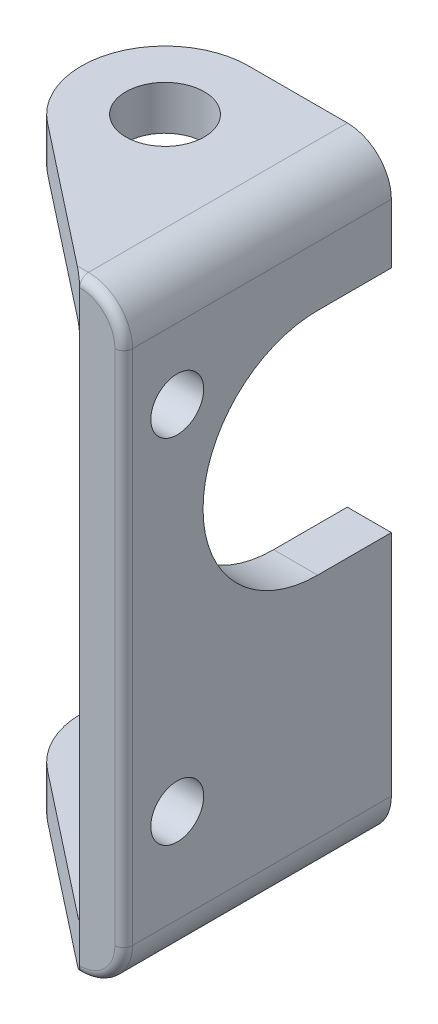
ISO-10303-21;
HEADER;
FILE_DESCRIPTION(('STEP AP214'),'2;1');
FILE_NAME('part.step','',(''),(''),'','','');
FILE_SCHEMA(('AUTOMOTIVE_DESIGN { 1 0 10303 214 1 1 1 1 }'));
ENDSEC;
DATA;
#1=APPLICATION_CONTEXT('core data for automotive mechanical design processes');
#2=APPLICATION_PROTOCOL_DEFINITION('international standard','automotive_design',2000,#1);
#3=PRODUCT_CONTEXT('',#1,'mechanical');
#4=PRODUCT('Part','Part','',(#3));
#5=PRODUCT_RELATED_PRODUCT_CATEGORY('part','',(#4));
#6=PRODUCT_DEFINITION_FORMATION('','',#4);
#7=PRODUCT_DEFINITION_CONTEXT('part definition',#1,'design');
#8=PRODUCT_DEFINITION('design','',#6,#7);
#9=PRODUCT_DEFINITION_SHAPE('','',#8);
#10=(LENGTH_UNIT() NAMED_UNIT(*) SI_UNIT(.MILLI.,.METRE.));
#11=(NAMED_UNIT(*) PLANE_ANGLE_UNIT() SI_UNIT($,.RADIAN.));
#12=(NAMED_UNIT(*) SI_UNIT($,.STERADIAN.) SOLID_ANGLE_UNIT());
#13=UNCERTAINTY_MEASURE_WITH_UNIT(LENGTH_MEASURE(1.E-05),#10,'distance_accuracy_value','');
#14=(GEOMETRIC_REPRESENTATION_CONTEXT(3) GLOBAL_UNCERTAINTY_ASSIGNED_CONTEXT((#13)) GLOBAL_UNIT_ASSIGNED_CONTEXT((#10,
#11,#12)) REPRESENTATION_CONTEXT('',''));
#15=CARTESIAN_POINT('',(0.,0.,0.));
#16=DIRECTION('',(0.,0.,1.));
#17=DIRECTION('',(1.,0.,0.));
#18=AXIS2_PLACEMENT_3D('',#15,#16,#17);
#19=CARTESIAN_POINT('',(-5.86914092412424,-34.32,7.46916448885226));
#20=DIRECTION('',(0.617854856392093,0.,-0.786292169891514));
#21=DIRECTION('',(-0.786292169891514,0.,-0.617854856392093));
#22=AXIS2_PLACEMENT_3D('',#19,#20,#21);
#23=PLANE('',#22);
#24=DIRECTION('',(-0.786292169891514,0.,-0.617854856392093));
#25=VECTOR('',#24,1.);
#26=CARTESIAN_POINT('',(-5.86914092412424,-34.32,7.46916448885226));
#27=LINE('',#26,#25);
#28=CARTESIAN_POINT('',(9.90738368606019,-34.32,19.8660860412273));
#29=VERTEX_POINT('',#28);
#30=CARTESIAN_POINT('',(-5.86914092412424,-34.32,7.46916448885226));
#31=VERTEX_POINT('',#30);
#32=EDGE_CURVE('E336',#29,#31,#27,.T.);
#33=ORIENTED_EDGE('',*,*,#32,.F.);
#34=CARTESIAN_POINT('',(9.90738368606019,-33.32,19.8660860412273));
#35=DIRECTION('',(0.617854856392093,0.,-0.786292169891514));
#36=DIRECTION('',(0.786292169891514,0.,0.617854856392093));
#37=AXIS2_PLACEMENT_3D('',#34,#35,#36);
#38=ELLIPSE('',#37,1.61850309931916,1.);
#39=CARTESIAN_POINT('',(11.18,-33.32,20.8660860412273));
#40=VERTEX_POINT('',#39);
#41=EDGE_CURVE('E185',#29,#40,#38,.F.);
#42=ORIENTED_EDGE('',*,*,#41,.T.);
#43=DIRECTION('',(0.,1.,0.));
#44=VECTOR('',#43,1.);
#45=CARTESIAN_POINT('',(11.18,-34.32,20.8660860412273));
#46=LINE('',#45,#44);
#47=CARTESIAN_POINT('',(11.18,-28.32,20.8660860412273));
#48=VERTEX_POINT('',#47);
#49=EDGE_CURVE('E179',#40,#48,#46,.T.);
#50=ORIENTED_EDGE('',*,*,#49,.T.);
#51=CARTESIAN_POINT('',(10.18,-28.32,20.0803032494727));
#52=DIRECTION('',(0.617854856392093,0.,-0.786292169891514));
#53=DIRECTION('',(0.786292169891514,0.,0.617854856392093));
#54=AXIS2_PLACEMENT_3D('',#51,#52,#53);
#55=ELLIPSE('',#54,1.2717918838464,1.);
#56=CARTESIAN_POINT('',(10.18,-29.32,20.0803032494727));
#57=VERTEX_POINT('',#56);
#58=EDGE_CURVE('E183',#48,#57,#55,.T.);
#59=ORIENTED_EDGE('',*,*,#58,.T.);
#60=DIRECTION('',(0.786292169891514,0.,0.617854856392093));
#61=VECTOR('',#60,1.);
#62=CARTESIAN_POINT('',(-3.82674398136235,-29.32,9.07404486040664));
#63=LINE('',#62,#61);
#64=CARTESIAN_POINT('',(-5.86914092412424,-29.32,7.46916448885226));
#65=VERTEX_POINT('',#64);
#66=EDGE_CURVE('E202',#65,#57,#63,.T.);
#67=ORIENTED_EDGE('',*,*,#66,.F.);
#68=DIRECTION('',(0.,1.,0.));
#69=VECTOR('',#68,1.);
#70=CARTESIAN_POINT('',(-5.86914092412424,-34.32,7.46916448885226));
#71=LINE('',#70,#69);
#72=EDGE_CURVE('E349',#31,#65,#71,.T.);
#73=ORIENTED_EDGE('',*,*,#72,.F.);
#74=EDGE_LOOP('',(#33,#42,#50,#59,#67,#73));
#75=FACE_BOUND('',#74,.T.);
#76=ADVANCED_FACE('F47',(#75),#23,.F.);
#77=CARTESIAN_POINT('',(16.18,-34.32,24.795));
#78=DIRECTION('',(-1.,0.,0.));
#79=DIRECTION('',(0.,0.,1.));
#80=AXIS2_PLACEMENT_3D('',#77,#78,#79);
#81=PLANE('',#80);
#82=CARTESIAN_POINT('',(16.18,-18.68,14.795));
#83=DIRECTION('',(-1.,0.,0.));
#84=DIRECTION('',(0.,-1.,0.));
#85=AXIS2_PLACEMENT_3D('',#82,#83,#84);
#86=CIRCLE('',#85,3.);
#87=CARTESIAN_POINT('',(16.18,-21.68,14.795));
#88=VERTEX_POINT('',#87);
#89=EDGE_CURVE('E275',#88,#88,#86,.T.);
#90=ORIENTED_EDGE('',*,*,#89,.T.);
#91=EDGE_LOOP('',(#90));
#92=FACE_BOUND('',#91,.T.);
#93=CARTESIAN_POINT('',(16.18,21.32,14.795));
#94=DIRECTION('',(-1.,0.,0.));
#95=DIRECTION('',(0.,-1.,0.));
#96=AXIS2_PLACEMENT_3D('',#93,#94,#95);
#97=CIRCLE('',#96,3.);
#98=CARTESIAN_POINT('',(16.18,18.32,14.795));
#99=VERTEX_POINT('',#98);
#100=EDGE_CURVE('E189',#99,#99,#97,.T.);
#101=ORIENTED_EDGE('',*,*,#100,.T.);
#102=EDGE_LOOP('',(#101));
#103=FACE_BOUND('',#102,.T.);
#104=DIRECTION('',(0.,0.,-1.));
#105=VECTOR('',#104,1.);
#106=CARTESIAN_POINT('',(16.18,29.32,24.795));
#107=LINE('',#106,#105);
#108=CARTESIAN_POINT('',(16.18,29.32,-9.49922277603602));
#109=VERTEX_POINT('',#108);
#110=CARTESIAN_POINT('',(16.18,29.32,19.8660860412273));
#111=VERTEX_POINT('',#110);
#112=EDGE_CURVE('E400',#109,#111,#107,.F.);
#113=ORIENTED_EDGE('',*,*,#112,.T.);
#114=DIRECTION('',(0.,1.,0.));
#115=VECTOR('',#114,1.);
#116=CARTESIAN_POINT('',(16.18,-34.32,19.8660860412273));
#117=LINE('',#116,#115);
#118=CARTESIAN_POINT('',(16.18,-29.32,19.8660860412273));
#119=VERTEX_POINT('',#118);
#120=EDGE_CURVE('E246',#111,#119,#117,.F.);
#121=ORIENTED_EDGE('',*,*,#120,.T.);
#122=DIRECTION('',(0.,0.,-1.));
#123=VECTOR('',#122,1.);
#124=CARTESIAN_POINT('',(16.18,-29.32,24.795));
#125=LINE('',#124,#123);
#126=CARTESIAN_POINT('',(16.18,-29.32,-9.49922277603602));
#127=VERTEX_POINT('',#126);
#128=EDGE_CURVE('E404',#119,#127,#125,.T.);
#129=ORIENTED_EDGE('',*,*,#128,.T.);
#130=DIRECTION('',(0.,1.,0.));
#131=VECTOR('',#130,1.);
#132=CARTESIAN_POINT('',(16.18,-34.32,-9.49922277603602));
#133=LINE('',#132,#131);
#134=CARTESIAN_POINT('',(16.18,-3.43,-9.49922277603602));
#135=VERTEX_POINT('',#134);
#136=EDGE_CURVE('E354',#127,#135,#133,.T.);
#137=ORIENTED_EDGE('',*,*,#136,.T.);
#138=DIRECTION('',(0.,0.,-1.));
#139=VECTOR('',#138,1.);
#140=CARTESIAN_POINT('',(16.18,-3.43,0.));
#141=LINE('',#140,#139);
#142=CARTESIAN_POINT('',(16.18,-3.43,-1.13391395877272));
#143=VERTEX_POINT('',#142);
#144=EDGE_CURVE('E291',#143,#135,#141,.T.);
#145=ORIENTED_EDGE('',*,*,#144,.F.);
#146=CARTESIAN_POINT('',(16.18,9.57,-1.13391395877272));
#147=DIRECTION('',(-1.,0.,0.));
#148=DIRECTION('',(0.,-1.,0.));
#149=AXIS2_PLACEMENT_3D('',#146,#147,#148);
#150=CIRCLE('',#149,13.);
#151=CARTESIAN_POINT('',(16.18,22.57,-1.13391395877272));
#152=VERTEX_POINT('',#151);
#153=EDGE_CURVE('E295',#143,#152,#150,.T.);
#154=ORIENTED_EDGE('',*,*,#153,.T.);
#155=DIRECTION('',(0.,0.,-1.));
#156=VECTOR('',#155,1.);
#157=CARTESIAN_POINT('',(16.18,22.57,0.));
#158=LINE('',#157,#156);
#159=CARTESIAN_POINT('',(16.18,22.57,-9.49922277603602));
#160=VERTEX_POINT('',#159);
#161=EDGE_CURVE('E300',#152,#160,#158,.T.);
#162=ORIENTED_EDGE('',*,*,#161,.T.);
#163=EDGE_CURVE('E357',#160,#109,#133,.T.);
#164=ORIENTED_EDGE('',*,*,#163,.T.);
#165=EDGE_LOOP('',(#113,#121,#129,#137,#145,#154,#162,#164));
#166=FACE_BOUND('',#165,.T.);
#167=ADVANCED_FACE('F446',(#92,#103,#166),#81,.F.);
#168=CARTESIAN_POINT('',(11.18,29.32,24.795));
#169=DIRECTION('',(1.,0.,0.));
#170=DIRECTION('',(0.,1.,0.));
#171=AXIS2_PLACEMENT_3D('',#168,#169,#170);
#172=PLANE('',#171);
#173=CARTESIAN_POINT('',(11.18,-18.68,14.795));
#174=DIRECTION('',(-1.,0.,0.));
#175=DIRECTION('',(0.,-1.,0.));
#176=AXIS2_PLACEMENT_3D('',#173,#174,#175);
#177=CIRCLE('',#176,3.);
#178=CARTESIAN_POINT('',(11.18,-21.68,14.795));
#179=VERTEX_POINT('',#178);
#180=EDGE_CURVE('E280',#179,#179,#177,.T.);
#181=ORIENTED_EDGE('',*,*,#180,.F.);
#182=EDGE_LOOP('',(#181));
#183=FACE_BOUND('',#182,.T.);
#184=CARTESIAN_POINT('',(11.18,21.32,14.795));
#185=DIRECTION('',(-1.,0.,0.));
#186=DIRECTION('',(0.,-1.,0.));
#187=AXIS2_PLACEMENT_3D('',#184,#185,#186);
#188=CIRCLE('',#187,3.);
#189=CARTESIAN_POINT('',(11.18,18.32,14.795));
#190=VERTEX_POINT('',#189);
#191=EDGE_CURVE('E284',#190,#190,#188,.T.);
#192=ORIENTED_EDGE('',*,*,#191,.F.);
#193=EDGE_LOOP('',(#192));
#194=FACE_BOUND('',#193,.T.);
#195=DIRECTION('',(0.,1.,0.));
#196=VECTOR('',#195,1.);
#197=CARTESIAN_POINT('',(11.18,29.32,20.8660860412273));
#198=LINE('',#197,#196);
#199=CARTESIAN_POINT('',(11.18,28.32,20.8660860412273));
#200=VERTEX_POINT('',#199);
#201=EDGE_CURVE('E193',#48,#200,#198,.T.);
#202=ORIENTED_EDGE('',*,*,#201,.T.);
#203=DIRECTION('',(0.,0.,-1.));
#204=VECTOR('',#203,1.);
#205=CARTESIAN_POINT('',(11.18,28.32,-9.49922277603602));
#206=LINE('',#205,#204);
#207=CARTESIAN_POINT('',(11.18,28.32,-9.49922277603602));
#208=VERTEX_POINT('',#207);
#209=EDGE_CURVE('E213',#200,#208,#206,.T.);
#210=ORIENTED_EDGE('',*,*,#209,.T.);
#211=DIRECTION('',(0.,-1.,0.));
#212=VECTOR('',#211,1.);
#213=CARTESIAN_POINT('',(11.18,29.32,-9.49922277603602));
#214=LINE('',#213,#212);
#215=CARTESIAN_POINT('',(11.18,22.57,-9.49922277603602));
#216=VERTEX_POINT('',#215);
#217=EDGE_CURVE('E369',#208,#216,#214,.T.);
#218=ORIENTED_EDGE('',*,*,#217,.T.);
#219=DIRECTION('',(0.,0.,-1.));
#220=VECTOR('',#219,1.);
#221=CARTESIAN_POINT('',(11.18,22.57,0.));
#222=LINE('',#221,#220);
#223=CARTESIAN_POINT('',(11.18,22.57,-1.13391395877272));
#224=VERTEX_POINT('',#223);
#225=EDGE_CURVE('E296',#224,#216,#222,.T.);
#226=ORIENTED_EDGE('',*,*,#225,.F.);
#227=CARTESIAN_POINT('',(11.18,9.57,-1.13391395877272));
#228=DIRECTION('',(-1.,0.,0.));
#229=DIRECTION('',(0.,-1.,0.));
#230=AXIS2_PLACEMENT_3D('',#227,#228,#229);
#231=CIRCLE('',#230,13.);
#232=CARTESIAN_POINT('',(11.18,-3.43,-1.13391395877272));
#233=VERTEX_POINT('',#232);
#234=EDGE_CURVE('E307',#233,#224,#231,.T.);
#235=ORIENTED_EDGE('',*,*,#234,.F.);
#236=DIRECTION('',(0.,0.,-1.));
#237=VECTOR('',#236,1.);
#238=CARTESIAN_POINT('',(11.18,-3.43,0.));
#239=LINE('',#238,#237);
#240=CARTESIAN_POINT('',(11.18,-3.43,-9.49922277603602));
#241=VERTEX_POINT('',#240);
#242=EDGE_CURVE('E279',#233,#241,#239,.T.);
#243=ORIENTED_EDGE('',*,*,#242,.T.);
#244=CARTESIAN_POINT('',(11.18,-28.32,-9.49922277603602));
#245=VERTEX_POINT('',#244);
#246=EDGE_CURVE('E210',#241,#245,#214,.T.);
#247=ORIENTED_EDGE('',*,*,#246,.T.);
#248=DIRECTION('',(0.,0.,-1.));
#249=VECTOR('',#248,1.);
#250=CARTESIAN_POINT('',(11.18,-28.32,20.8660860412273));
#251=LINE('',#250,#249);
#252=EDGE_CURVE('E206',#245,#48,#251,.F.);
#253=ORIENTED_EDGE('',*,*,#252,.T.);
#254=EDGE_LOOP('',(#202,#210,#218,#226,#235,#243,#247,#253));
#255=FACE_BOUND('',#254,.T.);
#256=ADVANCED_FACE('F207',(#183,#194,#255),#172,.F.);
#257=CARTESIAN_POINT('',(0.,-34.32,-9.49922277603602));
#258=DIRECTION('',(0.,0.,1.));
#259=DIRECTION('',(1.,0.,0.));
#260=AXIS2_PLACEMENT_3D('',#257,#258,#259);
#261=PLANE('',#260);
#262=ORIENTED_EDGE('',*,*,#136,.F.);
#263=CARTESIAN_POINT('',(11.18,-29.32,-9.49922277603602));
#264=DIRECTION('',(0.,0.,1.));
#265=DIRECTION('',(1.,0.,0.));
#266=AXIS2_PLACEMENT_3D('',#263,#264,#265);
#267=CIRCLE('',#266,5.);
#268=CARTESIAN_POINT('',(11.18,-34.32,-9.49922277603602));
#269=VERTEX_POINT('',#268);
#270=EDGE_CURVE('E407',#127,#269,#267,.F.);
#271=ORIENTED_EDGE('',*,*,#270,.T.);
#272=DIRECTION('',(1.,0.,0.));
#273=VECTOR('',#272,1.);
#274=CARTESIAN_POINT('',(0.,-34.32,-9.49922277603602));
#275=LINE('',#274,#273);
#276=CARTESIAN_POINT('',(0.,-34.32,-9.49922277603602));
#277=VERTEX_POINT('',#276);
#278=EDGE_CURVE('E331',#277,#269,#275,.T.);
#279=ORIENTED_EDGE('',*,*,#278,.F.);
#280=DIRECTION('',(0.,1.,0.));
#281=VECTOR('',#280,1.);
#282=CARTESIAN_POINT('',(0.,-34.32,-9.49922277603602));
#283=LINE('',#282,#281);
#284=CARTESIAN_POINT('',(0.,-29.32,-9.49922277603602));
#285=VERTEX_POINT('',#284);
#286=EDGE_CURVE('E358',#277,#285,#283,.T.);
#287=ORIENTED_EDGE('',*,*,#286,.T.);
#288=DIRECTION('',(-1.,0.,0.));
#289=VECTOR('',#288,1.);
#290=CARTESIAN_POINT('',(-16.18,-29.32,-9.49922277603602));
#291=LINE('',#290,#289);
#292=CARTESIAN_POINT('',(10.18,-29.32,-9.49922277603602));
#293=VERTEX_POINT('',#292);
#294=EDGE_CURVE('E366',#293,#285,#291,.T.);
#295=ORIENTED_EDGE('',*,*,#294,.F.);
#296=CARTESIAN_POINT('',(10.18,-28.32,-9.49922277603602));
#297=DIRECTION('',(0.,0.,1.));
#298=DIRECTION('',(1.,0.,0.));
#299=AXIS2_PLACEMENT_3D('',#296,#297,#298);
#300=CIRCLE('',#299,1.);
#301=EDGE_CURVE('E222',#293,#245,#300,.T.);
#302=ORIENTED_EDGE('',*,*,#301,.T.);
#303=ORIENTED_EDGE('',*,*,#246,.F.);
#304=DIRECTION('',(-1.,0.,0.));
#305=VECTOR('',#304,1.);
#306=CARTESIAN_POINT('',(16.18,-3.43,-9.49922277603602));
#307=LINE('',#306,#305);
#308=EDGE_CURVE('E314',#135,#241,#307,.T.);
#309=ORIENTED_EDGE('',*,*,#308,.F.);
#310=EDGE_LOOP('',(#262,#271,#279,#287,#295,#302,#303,#309));
#311=FACE_BOUND('',#310,.T.);
#312=ADVANCED_FACE('F458',(#311),#261,.F.);
#313=CARTESIAN_POINT('',(-16.18,34.32,24.795));
#314=DIRECTION('',(0.,-1.,0.));
#315=DIRECTION('',(0.,0.,-1.));
#316=AXIS2_PLACEMENT_3D('',#313,#314,#315);
#317=PLANE('',#316);
#318=CARTESIAN_POINT('',(0.,34.32,0.));
#319=DIRECTION('',(0.,1.,0.));
#320=DIRECTION('',(0.,0.,1.));
#321=AXIS2_PLACEMENT_3D('',#318,#319,#320);
#322=CIRCLE('',#321,4.45);
#323=CARTESIAN_POINT('',(0.,34.32,4.45));
#324=VERTEX_POINT('',#323);
#325=EDGE_CURVE('E384',#324,#324,#322,.T.);
#326=ORIENTED_EDGE('',*,*,#325,.F.);
#327=EDGE_LOOP('',(#326));
#328=FACE_BOUND('',#327,.T.);
#329=DIRECTION('',(-0.786292169891514,0.,-0.617854856392093));
#330=VECTOR('',#329,1.);
#331=CARTESIAN_POINT('',(-5.86914092412424,34.32,7.46916448885226));
#332=LINE('',#331,#330);
#333=CARTESIAN_POINT('',(9.90738368606019,34.32,19.8660860412273));
#334=VERTEX_POINT('',#333);
#335=CARTESIAN_POINT('',(-5.86914092412424,34.32,7.46916448885226));
#336=VERTEX_POINT('',#335);
#337=EDGE_CURVE('E332',#334,#336,#332,.T.);
#338=ORIENTED_EDGE('',*,*,#337,.F.);
#339=DIRECTION('',(-1.,0.,0.));
#340=VECTOR('',#339,1.);
#341=CARTESIAN_POINT('',(-16.18,34.32,19.8660860412273));
#342=LINE('',#341,#340);
#343=CARTESIAN_POINT('',(11.18,34.32,19.8660860412273));
#344=VERTEX_POINT('',#343);
#345=EDGE_CURVE('E57',#334,#344,#342,.F.);
#346=ORIENTED_EDGE('',*,*,#345,.T.);
#347=DIRECTION('',(0.,0.,-1.));
#348=VECTOR('',#347,1.);
#349=CARTESIAN_POINT('',(11.18,34.32,24.795));
#350=LINE('',#349,#348);
#351=CARTESIAN_POINT('',(11.18,34.32,-9.49922277603602));
#352=VERTEX_POINT('',#351);
#353=EDGE_CURVE('E414',#344,#352,#350,.T.);
#354=ORIENTED_EDGE('',*,*,#353,.T.);
#355=DIRECTION('',(1.,0.,0.));
#356=VECTOR('',#355,1.);
#357=CARTESIAN_POINT('',(0.,34.32,-9.49922277603602));
#358=LINE('',#357,#356);
#359=CARTESIAN_POINT('',(0.,34.32,-9.49922277603602));
#360=VERTEX_POINT('',#359);
#361=EDGE_CURVE('E343',#360,#352,#358,.T.);
#362=ORIENTED_EDGE('',*,*,#361,.F.);
#363=CARTESIAN_POINT('',(0.,34.32,0.));
#364=DIRECTION('',(0.,1.,0.));
#365=DIRECTION('',(0.,0.,1.));
#366=AXIS2_PLACEMENT_3D('',#363,#364,#365);
#367=CIRCLE('',#366,9.49922277603602);
#368=EDGE_CURVE('E317',#360,#336,#367,.T.);
#369=ORIENTED_EDGE('',*,*,#368,.T.);
#370=EDGE_LOOP('',(#338,#346,#354,#362,#369));
#371=FACE_BOUND('',#370,.T.);
#372=ADVANCED_FACE('F471',(#328,#371),#317,.F.);
#373=CARTESIAN_POINT('',(-16.18,29.32,24.795));
#374=DIRECTION('',(0.,1.,0.));
#375=DIRECTION('',(0.,0.,1.));
#376=AXIS2_PLACEMENT_3D('',#373,#374,#375);
#377=PLANE('',#376);
#378=CARTESIAN_POINT('',(0.,29.32,0.));
#379=DIRECTION('',(0.,1.,0.));
#380=DIRECTION('',(0.,0.,1.));
#381=AXIS2_PLACEMENT_3D('',#378,#379,#380);
#382=CIRCLE('',#381,4.45);
#383=CARTESIAN_POINT('',(0.,29.32,4.45));
#384=VERTEX_POINT('',#383);
#385=EDGE_CURVE('E396',#384,#384,#382,.T.);
#386=ORIENTED_EDGE('',*,*,#385,.T.);
#387=EDGE_LOOP('',(#386));
#388=FACE_BOUND('',#387,.T.);
#389=DIRECTION('',(1.,0.,0.));
#390=VECTOR('',#389,1.);
#391=CARTESIAN_POINT('',(-16.18,29.32,-9.49922277603602));
#392=LINE('',#391,#390);
#393=CARTESIAN_POINT('',(0.,29.32,-9.49922277603602));
#394=VERTEX_POINT('',#393);
#395=CARTESIAN_POINT('',(10.18,29.32,-9.49922277603602));
#396=VERTEX_POINT('',#395);
#397=EDGE_CURVE('E372',#394,#396,#392,.T.);
#398=ORIENTED_EDGE('',*,*,#397,.T.);
#399=DIRECTION('',(0.,0.,-1.));
#400=VECTOR('',#399,1.);
#401=CARTESIAN_POINT('',(10.18,29.32,20.8660860412273));
#402=LINE('',#401,#400);
#403=CARTESIAN_POINT('',(10.18,29.32,20.0803032494727));
#404=VERTEX_POINT('',#403);
#405=EDGE_CURVE('E421',#396,#404,#402,.F.);
#406=ORIENTED_EDGE('',*,*,#405,.T.);
#407=DIRECTION('',(-0.786292169891514,0.,-0.617854856392093));
#408=VECTOR('',#407,1.);
#409=CARTESIAN_POINT('',(-3.82674398136235,29.32,9.07404486040664));
#410=LINE('',#409,#408);
#411=CARTESIAN_POINT('',(-5.86914092412424,29.32,7.46916448885226));
#412=VERTEX_POINT('',#411);
#413=EDGE_CURVE('E201',#404,#412,#410,.T.);
#414=ORIENTED_EDGE('',*,*,#413,.T.);
#415=CARTESIAN_POINT('',(0.,29.32,0.));
#416=DIRECTION('',(0.,1.,0.));
#417=DIRECTION('',(0.,0.,1.));
#418=AXIS2_PLACEMENT_3D('',#415,#416,#417);
#419=CIRCLE('',#418,9.49922277603602);
#420=EDGE_CURVE('E380',#394,#412,#419,.T.);
#421=ORIENTED_EDGE('',*,*,#420,.F.);
#422=EDGE_LOOP('',(#398,#406,#414,#421));
#423=FACE_BOUND('',#422,.T.);
#424=ADVANCED_FACE('F533',(#388,#423),#377,.F.);
#425=CARTESIAN_POINT('',(-16.18,-29.32,24.795));
#426=DIRECTION('',(0.,-1.,0.));
#427=DIRECTION('',(1.,0.,0.));
#428=AXIS2_PLACEMENT_3D('',#425,#426,#427);
#429=PLANE('',#428);
#430=CARTESIAN_POINT('',(0.,-29.32,0.));
#431=DIRECTION('',(0.,-1.,0.));
#432=DIRECTION('',(1.,0.,0.));
#433=AXIS2_PLACEMENT_3D('',#430,#431,#432);
#434=CIRCLE('',#433,4.45);
#435=CARTESIAN_POINT('',(4.45,-29.32,0.));
#436=VERTEX_POINT('',#435);
#437=EDGE_CURVE('E389',#436,#436,#434,.T.);
#438=ORIENTED_EDGE('',*,*,#437,.T.);
#439=EDGE_LOOP('',(#438));
#440=FACE_BOUND('',#439,.T.);
#441=ORIENTED_EDGE('',*,*,#66,.T.);
#442=DIRECTION('',(0.,0.,-1.));
#443=VECTOR('',#442,1.);
#444=CARTESIAN_POINT('',(10.18,-29.32,-9.49922277603602));
#445=LINE('',#444,#443);
#446=EDGE_CURVE('E219',#57,#293,#445,.T.);
#447=ORIENTED_EDGE('',*,*,#446,.T.);
#448=ORIENTED_EDGE('',*,*,#294,.T.);
#449=CARTESIAN_POINT('',(0.,-29.32,0.));
#450=DIRECTION('',(0.,-1.,0.));
#451=DIRECTION('',(1.,0.,0.));
#452=AXIS2_PLACEMENT_3D('',#449,#450,#451);
#453=CIRCLE('',#452,9.49922277603602);
#454=EDGE_CURVE('E376',#65,#285,#453,.T.);
#455=ORIENTED_EDGE('',*,*,#454,.F.);
#456=EDGE_LOOP('',(#441,#447,#448,#455));
#457=FACE_BOUND('',#456,.T.);
#458=ADVANCED_FACE('F545',(#440,#457),#429,.F.);
#459=CARTESIAN_POINT('',(-16.18,-34.32,24.795));
#460=DIRECTION('',(0.,1.,0.));
#461=DIRECTION('',(0.,0.,1.));
#462=AXIS2_PLACEMENT_3D('',#459,#460,#461);
#463=PLANE('',#462);
#464=CARTESIAN_POINT('',(0.,-34.32,0.));
#465=DIRECTION('',(0.,1.,0.));
#466=DIRECTION('',(0.,0.,1.));
#467=AXIS2_PLACEMENT_3D('',#464,#465,#466);
#468=CIRCLE('',#467,4.45);
#469=CARTESIAN_POINT('',(0.,-34.32,4.45));
#470=VERTEX_POINT('',#469);
#471=EDGE_CURVE('E385',#470,#470,#468,.T.);
#472=ORIENTED_EDGE('',*,*,#471,.T.);
#473=EDGE_LOOP('',(#472));
#474=FACE_BOUND('',#473,.T.);
#475=DIRECTION('',(0.,0.,-1.));
#476=VECTOR('',#475,1.);
#477=CARTESIAN_POINT('',(11.18,-34.32,24.795));
#478=LINE('',#477,#476);
#479=CARTESIAN_POINT('',(11.18,-34.32,19.8660860412273));
#480=VERTEX_POINT('',#479);
#481=EDGE_CURVE('E410',#269,#480,#478,.F.);
#482=ORIENTED_EDGE('',*,*,#481,.T.);
#483=DIRECTION('',(1.,0.,0.));
#484=VECTOR('',#483,1.);
#485=CARTESIAN_POINT('',(-16.18,-34.32,19.8660860412273));
#486=LINE('',#485,#484);
#487=EDGE_CURVE('E240',#480,#29,#486,.F.);
#488=ORIENTED_EDGE('',*,*,#487,.T.);
#489=ORIENTED_EDGE('',*,*,#32,.T.);
#490=CARTESIAN_POINT('',(0.,-34.32,0.));
#491=DIRECTION('',(0.,1.,0.));
#492=DIRECTION('',(0.,0.,1.));
#493=AXIS2_PLACEMENT_3D('',#490,#491,#492);
#494=CIRCLE('',#493,9.49922277603602);
#495=EDGE_CURVE('E327',#277,#31,#494,.T.);
#496=ORIENTED_EDGE('',*,*,#495,.F.);
#497=ORIENTED_EDGE('',*,*,#278,.T.);
#498=EDGE_LOOP('',(#482,#488,#489,#496,#497));
#499=FACE_BOUND('',#498,.T.);
#500=ADVANCED_FACE('F489',(#474,#499),#463,.F.);
#501=CARTESIAN_POINT('',(0.,-34.32,0.));
#502=DIRECTION('',(0.,1.,0.));
#503=DIRECTION('',(0.,0.,1.));
#504=AXIS2_PLACEMENT_3D('',#501,#502,#503);
#505=CYLINDRICAL_SURFACE('',#504,4.45);
#506=ORIENTED_EDGE('',*,*,#471,.F.);
#507=EDGE_LOOP('',(#506));
#508=FACE_BOUND('',#507,.T.);
#509=ORIENTED_EDGE('',*,*,#437,.F.);
#510=EDGE_LOOP('',(#509));
#511=FACE_BOUND('',#510,.T.);
#512=ADVANCED_FACE('F713',(#508,#511),#505,.F.);
#513=ORIENTED_EDGE('',*,*,#325,.T.);
#514=EDGE_LOOP('',(#513));
#515=FACE_BOUND('',#514,.T.);
#516=ORIENTED_EDGE('',*,*,#385,.F.);
#517=EDGE_LOOP('',(#516));
#518=FACE_BOUND('',#517,.T.);
#519=ADVANCED_FACE('F706',(#515,#518),#505,.F.);
#520=CARTESIAN_POINT('',(0.,-34.32,0.));
#521=DIRECTION('',(0.,1.,0.));
#522=DIRECTION('',(0.,0.,1.));
#523=AXIS2_PLACEMENT_3D('',#520,#521,#522);
#524=CYLINDRICAL_SURFACE('',#523,9.49922277603602);
#525=ORIENTED_EDGE('',*,*,#420,.T.);
#526=EDGE_CURVE('E353',#412,#336,#71,.T.);
#527=ORIENTED_EDGE('',*,*,#526,.T.);
#528=ORIENTED_EDGE('',*,*,#368,.F.);
#529=EDGE_CURVE('E339',#394,#360,#283,.T.);
#530=ORIENTED_EDGE('',*,*,#529,.F.);
#531=EDGE_LOOP('',(#525,#527,#528,#530));
#532=FACE_BOUND('',#531,.T.);
#533=ADVANCED_FACE('F470',(#532),#524,.T.);
#534=ORIENTED_EDGE('',*,*,#454,.T.);
#535=ORIENTED_EDGE('',*,*,#286,.F.);
#536=ORIENTED_EDGE('',*,*,#495,.T.);
#537=ORIENTED_EDGE('',*,*,#72,.T.);
#538=EDGE_LOOP('',(#534,#535,#536,#537));
#539=FACE_BOUND('',#538,.T.);
#540=ADVANCED_FACE('F519',(#539),#524,.T.);
#541=ORIENTED_EDGE('',*,*,#361,.T.);
#542=CARTESIAN_POINT('',(11.18,29.32,-9.49922277603602));
#543=DIRECTION('',(0.,0.,1.));
#544=DIRECTION('',(1.,0.,0.));
#545=AXIS2_PLACEMENT_3D('',#542,#543,#544);
#546=CIRCLE('',#545,5.);
#547=EDGE_CURVE('E214',#352,#109,#546,.F.);
#548=ORIENTED_EDGE('',*,*,#547,.T.);
#549=ORIENTED_EDGE('',*,*,#163,.F.);
#550=DIRECTION('',(-1.,0.,0.));
#551=VECTOR('',#550,1.);
#552=CARTESIAN_POINT('',(16.18,22.57,-9.49922277603602));
#553=LINE('',#552,#551);
#554=EDGE_CURVE('E318',#160,#216,#553,.T.);
#555=ORIENTED_EDGE('',*,*,#554,.T.);
#556=ORIENTED_EDGE('',*,*,#217,.F.);
#557=CARTESIAN_POINT('',(10.18,28.32,-9.49922277603602));
#558=DIRECTION('',(0.,0.,1.));
#559=DIRECTION('',(1.,0.,0.));
#560=AXIS2_PLACEMENT_3D('',#557,#558,#559);
#561=CIRCLE('',#560,1.);
#562=EDGE_CURVE('E426',#208,#396,#561,.T.);
#563=ORIENTED_EDGE('',*,*,#562,.T.);
#564=ORIENTED_EDGE('',*,*,#397,.F.);
#565=ORIENTED_EDGE('',*,*,#529,.T.);
#566=EDGE_LOOP('',(#541,#548,#549,#555,#556,#563,#564,#565));
#567=FACE_BOUND('',#566,.T.);
#568=ADVANCED_FACE('F439',(#567),#261,.F.);
#569=CARTESIAN_POINT('',(11.18,33.32,20.8660860412273));
#570=VERTEX_POINT('',#569);
#571=EDGE_CURVE('E190',#200,#570,#46,.T.);
#572=ORIENTED_EDGE('',*,*,#571,.T.);
#573=CARTESIAN_POINT('',(9.90738368606019,33.32,19.8660860412273));
#574=DIRECTION('',(0.617854856392093,0.,-0.786292169891514));
#575=DIRECTION('',(-0.786292169891514,0.,-0.617854856392093));
#576=AXIS2_PLACEMENT_3D('',#573,#574,#575);
#577=ELLIPSE('',#576,1.61850309931916,1.);
#578=EDGE_CURVE('E72',#570,#334,#577,.F.);
#579=ORIENTED_EDGE('',*,*,#578,.T.);
#580=ORIENTED_EDGE('',*,*,#337,.T.);
#581=ORIENTED_EDGE('',*,*,#526,.F.);
#582=ORIENTED_EDGE('',*,*,#413,.F.);
#583=CARTESIAN_POINT('',(10.18,28.32,20.0803032494727));
#584=DIRECTION('',(0.617854856392093,0.,-0.786292169891514));
#585=DIRECTION('',(0.786292169891514,0.,0.617854856392093));
#586=AXIS2_PLACEMENT_3D('',#583,#584,#585);
#587=ELLIPSE('',#586,1.2717918838464,1.);
#588=EDGE_CURVE('E228',#404,#200,#587,.T.);
#589=ORIENTED_EDGE('',*,*,#588,.T.);
#590=EDGE_LOOP('',(#572,#579,#580,#581,#582,#589));
#591=FACE_BOUND('',#590,.T.);
#592=ADVANCED_FACE('F431',(#591),#23,.F.);
#593=CARTESIAN_POINT('',(16.18,-3.43,0.));
#594=DIRECTION('',(0.,1.,0.));
#595=DIRECTION('',(-1.,0.,0.));
#596=AXIS2_PLACEMENT_3D('',#593,#594,#595);
#597=PLANE('',#596);
#598=ORIENTED_EDGE('',*,*,#242,.F.);
#599=DIRECTION('',(-1.,0.,0.));
#600=VECTOR('',#599,1.);
#601=CARTESIAN_POINT('',(16.18,-3.43,-1.13391395877272));
#602=LINE('',#601,#600);
#603=EDGE_CURVE('E304',#143,#233,#602,.T.);
#604=ORIENTED_EDGE('',*,*,#603,.F.);
#605=ORIENTED_EDGE('',*,*,#144,.T.);
#606=ORIENTED_EDGE('',*,*,#308,.T.);
#607=EDGE_LOOP('',(#598,#604,#605,#606));
#608=FACE_BOUND('',#607,.T.);
#609=ADVANCED_FACE('F512',(#608),#597,.T.);
#610=CARTESIAN_POINT('',(16.18,22.57,0.));
#611=DIRECTION('',(0.,1.,0.));
#612=DIRECTION('',(-1.,0.,0.));
#613=AXIS2_PLACEMENT_3D('',#610,#611,#612);
#614=PLANE('',#613);
#615=ORIENTED_EDGE('',*,*,#225,.T.);
#616=ORIENTED_EDGE('',*,*,#554,.F.);
#617=ORIENTED_EDGE('',*,*,#161,.F.);
#618=DIRECTION('',(-1.,0.,0.));
#619=VECTOR('',#618,1.);
#620=CARTESIAN_POINT('',(16.18,22.57,-1.13391395877272));
#621=LINE('',#620,#619);
#622=EDGE_CURVE('E322',#152,#224,#621,.T.);
#623=ORIENTED_EDGE('',*,*,#622,.T.);
#624=EDGE_LOOP('',(#615,#616,#617,#623));
#625=FACE_BOUND('',#624,.T.);
#626=ADVANCED_FACE('F444',(#625),#614,.F.);
#627=CARTESIAN_POINT('',(16.18,9.57,-1.13391395877272));
#628=DIRECTION('',(-1.,0.,0.));
#629=DIRECTION('',(0.,-1.,0.));
#630=AXIS2_PLACEMENT_3D('',#627,#628,#629);
#631=CYLINDRICAL_SURFACE('',#630,13.);
#632=ORIENTED_EDGE('',*,*,#234,.T.);
#633=ORIENTED_EDGE('',*,*,#622,.F.);
#634=ORIENTED_EDGE('',*,*,#153,.F.);
#635=ORIENTED_EDGE('',*,*,#603,.T.);
#636=EDGE_LOOP('',(#632,#633,#634,#635));
#637=FACE_BOUND('',#636,.T.);
#638=ADVANCED_FACE('F451',(#637),#631,.F.);
#639=CARTESIAN_POINT('',(16.18,21.32,14.795));
#640=DIRECTION('',(-1.,0.,0.));
#641=DIRECTION('',(0.,-1.,0.));
#642=AXIS2_PLACEMENT_3D('',#639,#640,#641);
#643=CYLINDRICAL_SURFACE('',#642,3.);
#644=ORIENTED_EDGE('',*,*,#100,.F.);
#645=EDGE_LOOP('',(#644));
#646=FACE_BOUND('',#645,.T.);
#647=ORIENTED_EDGE('',*,*,#191,.T.);
#648=EDGE_LOOP('',(#647));
#649=FACE_BOUND('',#648,.T.);
#650=ADVANCED_FACE('F563',(#646,#649),#643,.F.);
#651=CARTESIAN_POINT('',(16.18,-18.68,14.795));
#652=DIRECTION('',(-1.,0.,0.));
#653=DIRECTION('',(0.,-1.,0.));
#654=AXIS2_PLACEMENT_3D('',#651,#652,#653);
#655=CYLINDRICAL_SURFACE('',#654,3.);
#656=ORIENTED_EDGE('',*,*,#89,.F.);
#657=EDGE_LOOP('',(#656));
#658=FACE_BOUND('',#657,.T.);
#659=ORIENTED_EDGE('',*,*,#180,.T.);
#660=EDGE_LOOP('',(#659));
#661=FACE_BOUND('',#660,.T.);
#662=ADVANCED_FACE('F550',(#658,#661),#655,.F.);
#663=CARTESIAN_POINT('',(11.18,-29.32,24.795));
#664=DIRECTION('',(0.,0.,-1.));
#665=DIRECTION('',(-1.,0.,0.));
#666=AXIS2_PLACEMENT_3D('',#663,#664,#665);
#667=CYLINDRICAL_SURFACE('',#666,5.);
#668=ORIENTED_EDGE('',*,*,#128,.F.);
#669=CARTESIAN_POINT('',(11.18,-29.32,19.8660860412273));
#670=DIRECTION('',(0.,0.,-1.));
#671=DIRECTION('',(-1.,0.,0.));
#672=AXIS2_PLACEMENT_3D('',#669,#670,#671);
#673=CIRCLE('',#672,5.);
#674=EDGE_CURVE('E237',#119,#480,#673,.T.);
#675=ORIENTED_EDGE('',*,*,#674,.T.);
#676=ORIENTED_EDGE('',*,*,#481,.F.);
#677=ORIENTED_EDGE('',*,*,#270,.F.);
#678=EDGE_LOOP('',(#668,#675,#676,#677));
#679=FACE_BOUND('',#678,.T.);
#680=ADVANCED_FACE('F485',(#679),#667,.T.);
#681=CARTESIAN_POINT('',(11.18,29.32,24.795));
#682=DIRECTION('',(0.,0.,-1.));
#683=DIRECTION('',(-1.,0.,0.));
#684=AXIS2_PLACEMENT_3D('',#681,#682,#683);
#685=CYLINDRICAL_SURFACE('',#684,5.);
#686=ORIENTED_EDGE('',*,*,#353,.F.);
#687=CARTESIAN_POINT('',(11.18,29.32,19.8660860412273));
#688=DIRECTION('',(0.,0.,-1.));
#689=DIRECTION('',(-1.,0.,0.));
#690=AXIS2_PLACEMENT_3D('',#687,#688,#689);
#691=CIRCLE('',#690,5.);
#692=EDGE_CURVE('E11',#344,#111,#691,.T.);
#693=ORIENTED_EDGE('',*,*,#692,.T.);
#694=ORIENTED_EDGE('',*,*,#112,.F.);
#695=ORIENTED_EDGE('',*,*,#547,.F.);
#696=EDGE_LOOP('',(#686,#693,#694,#695));
#697=FACE_BOUND('',#696,.T.);
#698=ADVANCED_FACE('F474',(#697),#685,.T.);
#699=CARTESIAN_POINT('',(10.18,28.32,24.795));
#700=DIRECTION('',(0.,0.,1.));
#701=DIRECTION('',(1.,0.,0.));
#702=AXIS2_PLACEMENT_3D('',#699,#700,#701);
#703=CYLINDRICAL_SURFACE('',#702,1.);
#704=ORIENTED_EDGE('',*,*,#588,.F.);
#705=ORIENTED_EDGE('',*,*,#405,.F.);
#706=ORIENTED_EDGE('',*,*,#562,.F.);
#707=ORIENTED_EDGE('',*,*,#209,.F.);
#708=EDGE_LOOP('',(#704,#705,#706,#707));
#709=FACE_BOUND('',#708,.T.);
#710=ADVANCED_FACE('F435',(#709),#703,.F.);
#711=CARTESIAN_POINT('',(10.18,-28.32,24.795));
#712=DIRECTION('',(0.,0.,1.));
#713=DIRECTION('',(1.,0.,0.));
#714=AXIS2_PLACEMENT_3D('',#711,#712,#713);
#715=CYLINDRICAL_SURFACE('',#714,1.);
#716=ORIENTED_EDGE('',*,*,#58,.F.);
#717=ORIENTED_EDGE('',*,*,#252,.F.);
#718=ORIENTED_EDGE('',*,*,#301,.F.);
#719=ORIENTED_EDGE('',*,*,#446,.F.);
#720=EDGE_LOOP('',(#716,#717,#718,#719));
#721=FACE_BOUND('',#720,.T.);
#722=ADVANCED_FACE('F217',(#721),#715,.F.);
#723=CARTESIAN_POINT('',(11.18,-34.32,20.8660860412273));
#724=DIRECTION('',(0.,0.,-1.));
#725=DIRECTION('',(-1.,0.,0.));
#726=AXIS2_PLACEMENT_3D('',#723,#724,#725);
#727=PLANE('',#726);
#728=ORIENTED_EDGE('',*,*,#49,.F.);
#729=CARTESIAN_POINT('',(11.18,-29.32,20.8660860412273));
#730=DIRECTION('',(0.,0.,-1.));
#731=DIRECTION('',(-1.,0.,0.));
#732=AXIS2_PLACEMENT_3D('',#729,#730,#731);
#733=CIRCLE('',#732,4.);
#734=CARTESIAN_POINT('',(15.18,-29.32,20.8660860412273));
#735=VERTEX_POINT('',#734);
#736=EDGE_CURVE('E234',#40,#735,#733,.F.);
#737=ORIENTED_EDGE('',*,*,#736,.T.);
#738=DIRECTION('',(0.,1.,0.));
#739=VECTOR('',#738,1.);
#740=CARTESIAN_POINT('',(15.18,-34.32,20.8660860412273));
#741=LINE('',#740,#739);
#742=CARTESIAN_POINT('',(15.18,29.32,20.8660860412273));
#743=VERTEX_POINT('',#742);
#744=EDGE_CURVE('E226',#735,#743,#741,.T.);
#745=ORIENTED_EDGE('',*,*,#744,.T.);
#746=CARTESIAN_POINT('',(11.18,29.32,20.8660860412273));
#747=DIRECTION('',(0.,0.,-1.));
#748=DIRECTION('',(-1.,0.,0.));
#749=AXIS2_PLACEMENT_3D('',#746,#747,#748);
#750=CIRCLE('',#749,4.);
#751=EDGE_CURVE('E221',#743,#570,#750,.F.);
#752=ORIENTED_EDGE('',*,*,#751,.T.);
#753=ORIENTED_EDGE('',*,*,#571,.F.);
#754=ORIENTED_EDGE('',*,*,#201,.F.);
#755=EDGE_LOOP('',(#728,#737,#745,#752,#753,#754));
#756=FACE_BOUND('',#755,.T.);
#757=ADVANCED_FACE('F195',(#756),#727,.F.);
#758=CARTESIAN_POINT('',(11.18,33.32,19.8660860412273));
#759=DIRECTION('',(-1.,0.,0.));
#760=DIRECTION('',(0.,0.,1.));
#761=AXIS2_PLACEMENT_3D('',#758,#759,#760);
#762=CYLINDRICAL_SURFACE('',#761,1.);
#763=ORIENTED_EDGE('',*,*,#345,.F.);
#764=ORIENTED_EDGE('',*,*,#578,.F.);
#765=CARTESIAN_POINT('',(11.18,33.32,19.8660860412273));
#766=DIRECTION('',(1.,0.,0.));
#767=DIRECTION('',(0.,0.,-1.));
#768=AXIS2_PLACEMENT_3D('',#765,#766,#767);
#769=CIRCLE('',#768,1.);
#770=EDGE_CURVE('E51',#344,#570,#769,.T.);
#771=ORIENTED_EDGE('',*,*,#770,.F.);
#772=EDGE_LOOP('',(#763,#764,#771));
#773=FACE_BOUND('',#772,.T.);
#774=ADVANCED_FACE('F49',(#773),#762,.T.);
#775=CARTESIAN_POINT('',(11.18,29.32,19.8660860412273));
#776=DIRECTION('',(0.,0.,-1.));
#777=DIRECTION('',(-1.,0.,0.));
#778=AXIS2_PLACEMENT_3D('',#775,#776,#777);
#779=TOROIDAL_SURFACE('',#778,4.,1.);
#780=ORIENTED_EDGE('',*,*,#770,.T.);
#781=ORIENTED_EDGE('',*,*,#751,.F.);
#782=CARTESIAN_POINT('',(15.18,29.32,19.8660860412273));
#783=DIRECTION('',(0.,-1.,0.));
#784=DIRECTION('',(0.,0.,-1.));
#785=AXIS2_PLACEMENT_3D('',#782,#783,#784);
#786=CIRCLE('',#785,1.);
#787=EDGE_CURVE('E260',#111,#743,#786,.T.);
#788=ORIENTED_EDGE('',*,*,#787,.F.);
#789=ORIENTED_EDGE('',*,*,#692,.F.);
#790=EDGE_LOOP('',(#780,#781,#788,#789));
#791=FACE_BOUND('',#790,.T.);
#792=ADVANCED_FACE('F476',(#791),#779,.T.);
#793=CARTESIAN_POINT('',(15.18,-34.32,19.8660860412273));
#794=DIRECTION('',(0.,1.,0.));
#795=DIRECTION('',(0.,0.,1.));
#796=AXIS2_PLACEMENT_3D('',#793,#794,#795);
#797=CYLINDRICAL_SURFACE('',#796,1.);
#798=ORIENTED_EDGE('',*,*,#787,.T.);
#799=ORIENTED_EDGE('',*,*,#744,.F.);
#800=CARTESIAN_POINT('',(15.18,-29.32,19.8660860412273));
#801=DIRECTION('',(0.,-1.,0.));
#802=DIRECTION('',(0.,0.,-1.));
#803=AXIS2_PLACEMENT_3D('',#800,#801,#802);
#804=CIRCLE('',#803,1.);
#805=EDGE_CURVE('E257',#119,#735,#804,.T.);
#806=ORIENTED_EDGE('',*,*,#805,.F.);
#807=ORIENTED_EDGE('',*,*,#120,.F.);
#808=EDGE_LOOP('',(#798,#799,#806,#807));
#809=FACE_BOUND('',#808,.T.);
#810=ADVANCED_FACE('F478',(#809),#797,.T.);
#811=CARTESIAN_POINT('',(11.18,-29.32,19.8660860412273));
#812=DIRECTION('',(0.,0.,-1.));
#813=DIRECTION('',(-1.,0.,0.));
#814=AXIS2_PLACEMENT_3D('',#811,#812,#813);
#815=TOROIDAL_SURFACE('',#814,4.,1.);
#816=ORIENTED_EDGE('',*,*,#805,.T.);
#817=ORIENTED_EDGE('',*,*,#736,.F.);
#818=CARTESIAN_POINT('',(11.18,-33.32,19.8660860412273));
#819=DIRECTION('',(-1.,0.,0.));
#820=DIRECTION('',(0.,0.,1.));
#821=AXIS2_PLACEMENT_3D('',#818,#819,#820);
#822=CIRCLE('',#821,1.);
#823=EDGE_CURVE('E253',#480,#40,#822,.T.);
#824=ORIENTED_EDGE('',*,*,#823,.F.);
#825=ORIENTED_EDGE('',*,*,#674,.F.);
#826=EDGE_LOOP('',(#816,#817,#824,#825));
#827=FACE_BOUND('',#826,.T.);
#828=ADVANCED_FACE('F482',(#827),#815,.T.);
#829=CARTESIAN_POINT('',(11.18,-33.32,19.8660860412273));
#830=DIRECTION('',(1.,0.,0.));
#831=DIRECTION('',(0.,0.,-1.));
#832=AXIS2_PLACEMENT_3D('',#829,#830,#831);
#833=CYLINDRICAL_SURFACE('',#832,1.);
#834=ORIENTED_EDGE('',*,*,#41,.F.);
#835=ORIENTED_EDGE('',*,*,#487,.F.);
#836=ORIENTED_EDGE('',*,*,#823,.T.);
#837=EDGE_LOOP('',(#834,#835,#836));
#838=FACE_BOUND('',#837,.T.);
#839=ADVANCED_FACE('F493',(#838),#833,.T.);
#840=CLOSED_SHELL('',(#76,#167,#256,#312,#372,#424,#458,#500,#512,#519,#533,#540,#568,#592,#609,
#626,#638,#650,#662,#680,#698,#710,#722,#757,#774,#792,#810,#828,#839));
#841=MANIFOLD_SOLID_BREP('B2',#840);
#842=ADVANCED_BREP_SHAPE_REPRESENTATION('',(#18,#841),#14);
#843=SHAPE_DEFINITION_REPRESENTATION(#9,#842);
ENDSEC;
END-ISO-10303-21;
